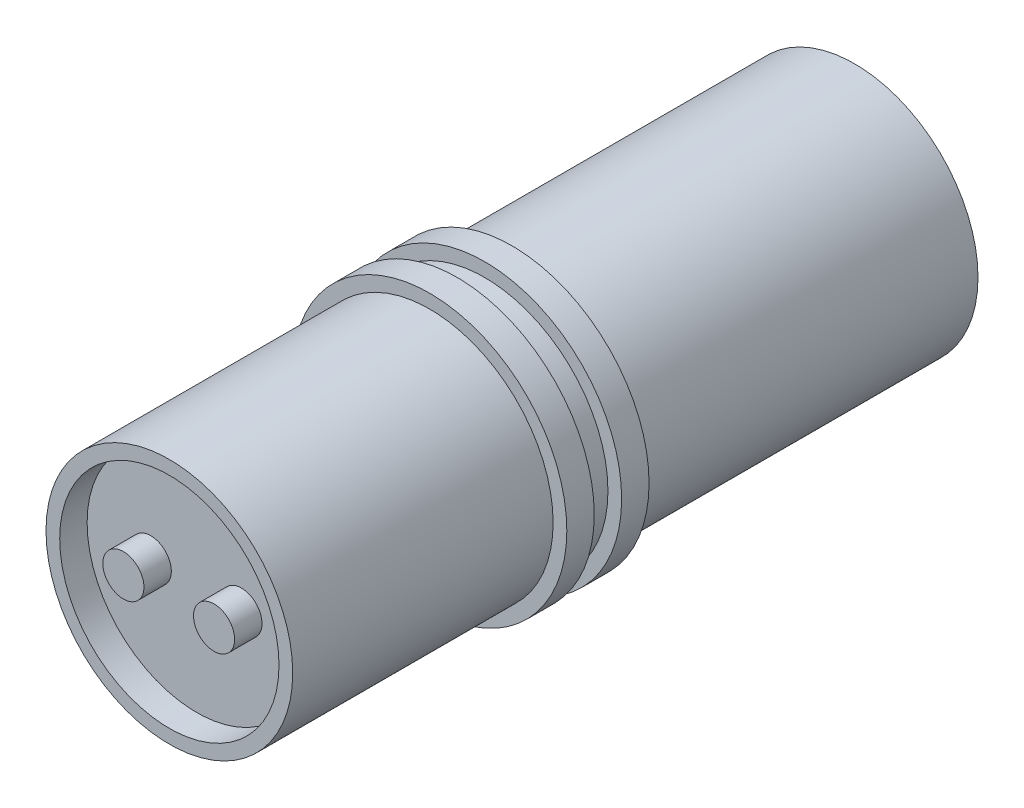
ISO-10303-21;
HEADER;
FILE_DESCRIPTION(('STEP AP214'),'2;1');
FILE_NAME('part.step','',(''),(''),'','','');
FILE_SCHEMA(('AUTOMOTIVE_DESIGN { 1 0 10303 214 1 1 1 1 }'));
ENDSEC;
DATA;
#1=APPLICATION_CONTEXT('core data for automotive mechanical design processes');
#2=APPLICATION_PROTOCOL_DEFINITION('international standard','automotive_design',2000,#1);
#3=PRODUCT_CONTEXT('',#1,'mechanical');
#4=PRODUCT('Part','Part','',(#3));
#5=PRODUCT_RELATED_PRODUCT_CATEGORY('part','',(#4));
#6=PRODUCT_DEFINITION_FORMATION('','',#4);
#7=PRODUCT_DEFINITION_CONTEXT('part definition',#1,'design');
#8=PRODUCT_DEFINITION('design','',#6,#7);
#9=PRODUCT_DEFINITION_SHAPE('','',#8);
#10=(LENGTH_UNIT() NAMED_UNIT(*) SI_UNIT(.MILLI.,.METRE.));
#11=(NAMED_UNIT(*) PLANE_ANGLE_UNIT() SI_UNIT($,.RADIAN.));
#12=(NAMED_UNIT(*) SI_UNIT($,.STERADIAN.) SOLID_ANGLE_UNIT());
#13=UNCERTAINTY_MEASURE_WITH_UNIT(LENGTH_MEASURE(1.E-05),#10,'distance_accuracy_value','');
#14=(GEOMETRIC_REPRESENTATION_CONTEXT(3) GLOBAL_UNCERTAINTY_ASSIGNED_CONTEXT((#13)) GLOBAL_UNIT_ASSIGNED_CONTEXT((#10,
#11,#12)) REPRESENTATION_CONTEXT('',''));
#15=CARTESIAN_POINT('',(0.,0.,0.));
#16=DIRECTION('',(0.,0.,1.));
#17=DIRECTION('',(1.,0.,0.));
#18=AXIS2_PLACEMENT_3D('',#15,#16,#17);
#19=CARTESIAN_POINT('',(0.,0.,0.));
#20=DIRECTION('',(0.,0.,1.));
#21=DIRECTION('',(1.,0.,0.));
#22=AXIS2_PLACEMENT_3D('',#19,#20,#21);
#23=PLANE('',#22);
#24=CARTESIAN_POINT('',(0.,0.,0.));
#25=DIRECTION('',(0.,0.,1.));
#26=DIRECTION('',(1.,0.,0.));
#27=AXIS2_PLACEMENT_3D('',#24,#25,#26);
#28=CIRCLE('',#27,9.);
#29=CARTESIAN_POINT('',(9.,0.,0.));
#30=VERTEX_POINT('',#29);
#31=EDGE_CURVE('E38',#30,#30,#28,.T.);
#32=ORIENTED_EDGE('',*,*,#31,.F.);
#33=EDGE_LOOP('',(#32));
#34=FACE_BOUND('',#33,.T.);
#35=CARTESIAN_POINT('',(-1.71148067478555,4.4792255454098,0.));
#36=DIRECTION('',(0.,0.,-1.));
#37=DIRECTION('',(-1.,0.,0.));
#38=AXIS2_PLACEMENT_3D('',#35,#36,#37);
#39=CIRCLE('',#38,1.15731471558131);
#40=CARTESIAN_POINT('',(-2.63057405736059,5.18253536690231,0.));
#41=VERTEX_POINT('',#40);
#42=CARTESIAN_POINT('',(-0.792387292210506,3.7759157239173,0.));
#43=VERTEX_POINT('',#42);
#44=EDGE_CURVE('E97',#41,#43,#39,.T.);
#45=ORIENTED_EDGE('',*,*,#44,.F.);
#46=DIRECTION('',(0.607708354541435,0.794160283457025,0.));
#47=VECTOR('',#46,1.);
#48=CARTESIAN_POINT('',(-2.63057405736059,5.18253536690231,0.));
#49=LINE('',#48,#47);
#50=CARTESIAN_POINT('',(-6.05817279595736,0.703309821492509,0.));
#51=VERTEX_POINT('',#50);
#52=EDGE_CURVE('E94',#51,#41,#49,.T.);
#53=ORIENTED_EDGE('',*,*,#52,.F.);
#54=CARTESIAN_POINT('',(-5.13907941338232,0.,0.));
#55=DIRECTION('',(0.,0.,-1.));
#56=DIRECTION('',(-1.,0.,0.));
#57=AXIS2_PLACEMENT_3D('',#54,#55,#56);
#58=CIRCLE('',#57,1.15731471558131);
#59=CARTESIAN_POINT('',(-4.21998603080728,-0.703309821492509,0.));
#60=VERTEX_POINT('',#59);
#61=EDGE_CURVE('E56',#60,#51,#58,.T.);
#62=ORIENTED_EDGE('',*,*,#61,.F.);
#63=DIRECTION('',(-0.607708354541435,-0.794160283457025,0.));
#64=VECTOR('',#63,1.);
#65=CARTESIAN_POINT('',(-0.792387292210506,3.7759157239173,0.));
#66=LINE('',#65,#64);
#67=EDGE_CURVE('E51',#43,#60,#66,.T.);
#68=ORIENTED_EDGE('',*,*,#67,.F.);
#69=EDGE_LOOP('',(#45,#53,#62,#68));
#70=FACE_BOUND('',#69,.T.);
#71=ADVANCED_FACE('F34',(#34,#70),#23,.F.);
#72=CARTESIAN_POINT('',(0.,0.,25.));
#73=DIRECTION('',(0.,0.,-1.));
#74=DIRECTION('',(-1.,0.,0.));
#75=AXIS2_PLACEMENT_3D('',#72,#73,#74);
#76=CYLINDRICAL_SURFACE('',#75,9.);
#77=CARTESIAN_POINT('',(0.,0.,25.));
#78=DIRECTION('',(0.,0.,1.));
#79=DIRECTION('',(1.,0.,0.));
#80=AXIS2_PLACEMENT_3D('',#77,#78,#79);
#81=CIRCLE('',#80,9.);
#82=CARTESIAN_POINT('',(9.,0.,25.));
#83=VERTEX_POINT('',#82);
#84=EDGE_CURVE('E136',#83,#83,#81,.T.);
#85=ORIENTED_EDGE('',*,*,#84,.F.);
#86=EDGE_LOOP('',(#85));
#87=FACE_BOUND('',#86,.T.);
#88=ORIENTED_EDGE('',*,*,#31,.T.);
#89=EDGE_LOOP('',(#88));
#90=FACE_BOUND('',#89,.T.);
#91=ADVANCED_FACE('F36',(#87,#90),#76,.T.);
#92=CARTESIAN_POINT('',(0.,0.,27.));
#93=DIRECTION('',(0.,0.,-1.));
#94=DIRECTION('',(-1.,0.,0.));
#95=AXIS2_PLACEMENT_3D('',#92,#93,#94);
#96=CYLINDRICAL_SURFACE('',#95,10.);
#97=CARTESIAN_POINT('',(0.,0.,27.));
#98=DIRECTION('',(0.,0.,1.));
#99=DIRECTION('',(1.,0.,0.));
#100=AXIS2_PLACEMENT_3D('',#97,#98,#99);
#101=CIRCLE('',#100,10.);
#102=CARTESIAN_POINT('',(10.,0.,27.));
#103=VERTEX_POINT('',#102);
#104=EDGE_CURVE('E137',#103,#103,#101,.T.);
#105=ORIENTED_EDGE('',*,*,#104,.F.);
#106=EDGE_LOOP('',(#105));
#107=FACE_BOUND('',#106,.T.);
#108=CARTESIAN_POINT('',(0.,0.,25.));
#109=DIRECTION('',(0.,0.,1.));
#110=DIRECTION('',(1.,0.,0.));
#111=AXIS2_PLACEMENT_3D('',#108,#109,#110);
#112=CIRCLE('',#111,10.);
#113=CARTESIAN_POINT('',(10.,0.,25.));
#114=VERTEX_POINT('',#113);
#115=EDGE_CURVE('E133',#114,#114,#112,.T.);
#116=ORIENTED_EDGE('',*,*,#115,.T.);
#117=EDGE_LOOP('',(#116));
#118=FACE_BOUND('',#117,.T.);
#119=ADVANCED_FACE('F228',(#107,#118),#96,.T.);
#120=CARTESIAN_POINT('',(0.,0.,27.));
#121=DIRECTION('',(0.,0.,1.));
#122=DIRECTION('',(1.,0.,0.));
#123=AXIS2_PLACEMENT_3D('',#120,#121,#122);
#124=PLANE('',#123);
#125=CARTESIAN_POINT('',(0.,0.,27.));
#126=DIRECTION('',(0.,0.,1.));
#127=DIRECTION('',(1.,0.,0.));
#128=AXIS2_PLACEMENT_3D('',#125,#126,#127);
#129=CIRCLE('',#128,9.);
#130=CARTESIAN_POINT('',(9.,0.,27.));
#131=VERTEX_POINT('',#130);
#132=EDGE_CURVE('E43',#131,#131,#129,.T.);
#133=ORIENTED_EDGE('',*,*,#132,.F.);
#134=EDGE_LOOP('',(#133));
#135=FACE_BOUND('',#134,.T.);
#136=ORIENTED_EDGE('',*,*,#104,.T.);
#137=EDGE_LOOP('',(#136));
#138=FACE_BOUND('',#137,.T.);
#139=ADVANCED_FACE('F225',(#135,#138),#124,.T.);
#140=CARTESIAN_POINT('',(0.,0.,25.));
#141=DIRECTION('',(0.,0.,1.));
#142=DIRECTION('',(1.,0.,0.));
#143=AXIS2_PLACEMENT_3D('',#140,#141,#142);
#144=PLANE('',#143);
#145=ORIENTED_EDGE('',*,*,#84,.T.);
#146=EDGE_LOOP('',(#145));
#147=FACE_BOUND('',#146,.T.);
#148=ORIENTED_EDGE('',*,*,#115,.F.);
#149=EDGE_LOOP('',(#148));
#150=FACE_BOUND('',#149,.T.);
#151=ADVANCED_FACE('F223',(#147,#150),#144,.F.);
#152=CARTESIAN_POINT('',(0.,0.,29.));
#153=DIRECTION('',(0.,0.,-1.));
#154=DIRECTION('',(-1.,0.,0.));
#155=AXIS2_PLACEMENT_3D('',#152,#153,#154);
#156=CYLINDRICAL_SURFACE('',#155,9.);
#157=CARTESIAN_POINT('',(0.,0.,29.));
#158=DIRECTION('',(0.,0.,1.));
#159=DIRECTION('',(1.,0.,0.));
#160=AXIS2_PLACEMENT_3D('',#157,#158,#159);
#161=CIRCLE('',#160,9.);
#162=CARTESIAN_POINT('',(9.,0.,29.));
#163=VERTEX_POINT('',#162);
#164=EDGE_CURVE('E128',#163,#163,#161,.T.);
#165=ORIENTED_EDGE('',*,*,#164,.F.);
#166=EDGE_LOOP('',(#165));
#167=FACE_BOUND('',#166,.T.);
#168=ORIENTED_EDGE('',*,*,#132,.T.);
#169=EDGE_LOOP('',(#168));
#170=FACE_BOUND('',#169,.T.);
#171=ADVANCED_FACE('F219',(#167,#170),#156,.T.);
#172=CARTESIAN_POINT('',(0.,0.,31.));
#173=DIRECTION('',(0.,0.,-1.));
#174=DIRECTION('',(-1.,0.,0.));
#175=AXIS2_PLACEMENT_3D('',#172,#173,#174);
#176=CYLINDRICAL_SURFACE('',#175,10.);
#177=CARTESIAN_POINT('',(0.,0.,31.));
#178=DIRECTION('',(0.,0.,1.));
#179=DIRECTION('',(1.,0.,0.));
#180=AXIS2_PLACEMENT_3D('',#177,#178,#179);
#181=CIRCLE('',#180,10.);
#182=CARTESIAN_POINT('',(10.,0.,31.));
#183=VERTEX_POINT('',#182);
#184=EDGE_CURVE('E125',#183,#183,#181,.T.);
#185=ORIENTED_EDGE('',*,*,#184,.F.);
#186=EDGE_LOOP('',(#185));
#187=FACE_BOUND('',#186,.T.);
#188=CARTESIAN_POINT('',(0.,0.,29.));
#189=DIRECTION('',(0.,0.,1.));
#190=DIRECTION('',(1.,0.,0.));
#191=AXIS2_PLACEMENT_3D('',#188,#189,#190);
#192=CIRCLE('',#191,10.);
#193=CARTESIAN_POINT('',(10.,0.,29.));
#194=VERTEX_POINT('',#193);
#195=EDGE_CURVE('E123',#194,#194,#192,.T.);
#196=ORIENTED_EDGE('',*,*,#195,.T.);
#197=EDGE_LOOP('',(#196));
#198=FACE_BOUND('',#197,.T.);
#199=ADVANCED_FACE('F212',(#187,#198),#176,.T.);
#200=CARTESIAN_POINT('',(0.,0.,31.));
#201=DIRECTION('',(0.,0.,1.));
#202=DIRECTION('',(1.,0.,0.));
#203=AXIS2_PLACEMENT_3D('',#200,#201,#202);
#204=PLANE('',#203);
#205=CARTESIAN_POINT('',(0.,0.,31.));
#206=DIRECTION('',(0.,0.,1.));
#207=DIRECTION('',(1.,0.,0.));
#208=AXIS2_PLACEMENT_3D('',#205,#206,#207);
#209=CIRCLE('',#208,9.);
#210=CARTESIAN_POINT('',(9.,0.,31.));
#211=VERTEX_POINT('',#210);
#212=EDGE_CURVE('E11',#211,#211,#209,.T.);
#213=ORIENTED_EDGE('',*,*,#212,.F.);
#214=EDGE_LOOP('',(#213));
#215=FACE_BOUND('',#214,.T.);
#216=ORIENTED_EDGE('',*,*,#184,.T.);
#217=EDGE_LOOP('',(#216));
#218=FACE_BOUND('',#217,.T.);
#219=ADVANCED_FACE('F209',(#215,#218),#204,.T.);
#220=CARTESIAN_POINT('',(0.,0.,29.));
#221=DIRECTION('',(0.,0.,1.));
#222=DIRECTION('',(1.,0.,0.));
#223=AXIS2_PLACEMENT_3D('',#220,#221,#222);
#224=PLANE('',#223);
#225=ORIENTED_EDGE('',*,*,#164,.T.);
#226=EDGE_LOOP('',(#225));
#227=FACE_BOUND('',#226,.T.);
#228=ORIENTED_EDGE('',*,*,#195,.F.);
#229=EDGE_LOOP('',(#228));
#230=FACE_BOUND('',#229,.T.);
#231=ADVANCED_FACE('F207',(#227,#230),#224,.F.);
#232=CARTESIAN_POINT('',(0.,0.,50.));
#233=DIRECTION('',(0.,0.,-1.));
#234=DIRECTION('',(-1.,0.,0.));
#235=AXIS2_PLACEMENT_3D('',#232,#233,#234);
#236=CYLINDRICAL_SURFACE('',#235,9.);
#237=CARTESIAN_POINT('',(0.,0.,50.));
#238=DIRECTION('',(0.,0.,1.));
#239=DIRECTION('',(1.,0.,0.));
#240=AXIS2_PLACEMENT_3D('',#237,#238,#239);
#241=CIRCLE('',#240,9.);
#242=CARTESIAN_POINT('',(9.,0.,50.));
#243=VERTEX_POINT('',#242);
#244=EDGE_CURVE('E119',#243,#243,#241,.T.);
#245=ORIENTED_EDGE('',*,*,#244,.F.);
#246=EDGE_LOOP('',(#245));
#247=FACE_BOUND('',#246,.T.);
#248=ORIENTED_EDGE('',*,*,#212,.T.);
#249=EDGE_LOOP('',(#248));
#250=FACE_BOUND('',#249,.T.);
#251=ADVANCED_FACE('F203',(#247,#250),#236,.T.);
#252=CARTESIAN_POINT('',(0.,0.,50.));
#253=DIRECTION('',(0.,0.,1.));
#254=DIRECTION('',(1.,0.,0.));
#255=AXIS2_PLACEMENT_3D('',#252,#253,#254);
#256=PLANE('',#255);
#257=CARTESIAN_POINT('',(0.,0.,50.));
#258=DIRECTION('',(0.,0.,1.));
#259=DIRECTION('',(1.,0.,0.));
#260=AXIS2_PLACEMENT_3D('',#257,#258,#259);
#261=CIRCLE('',#260,8.);
#262=CARTESIAN_POINT('',(8.,0.,50.));
#263=VERTEX_POINT('',#262);
#264=EDGE_CURVE('E113',#263,#263,#261,.T.);
#265=ORIENTED_EDGE('',*,*,#264,.F.);
#266=EDGE_LOOP('',(#265));
#267=FACE_BOUND('',#266,.T.);
#268=ORIENTED_EDGE('',*,*,#244,.T.);
#269=EDGE_LOOP('',(#268));
#270=FACE_BOUND('',#269,.T.);
#271=ADVANCED_FACE('F199',(#267,#270),#256,.T.);
#272=CARTESIAN_POINT('',(0.,0.,48.));
#273=DIRECTION('',(0.,0.,1.));
#274=DIRECTION('',(1.,0.,0.));
#275=AXIS2_PLACEMENT_3D('',#272,#273,#274);
#276=CYLINDRICAL_SURFACE('',#275,8.);
#277=CARTESIAN_POINT('',(0.,0.,48.));
#278=DIRECTION('',(0.,0.,1.));
#279=DIRECTION('',(1.,0.,0.));
#280=AXIS2_PLACEMENT_3D('',#277,#278,#279);
#281=CIRCLE('',#280,8.);
#282=CARTESIAN_POINT('',(8.,0.,48.));
#283=VERTEX_POINT('',#282);
#284=EDGE_CURVE('E116',#283,#283,#281,.T.);
#285=ORIENTED_EDGE('',*,*,#284,.F.);
#286=EDGE_LOOP('',(#285));
#287=FACE_BOUND('',#286,.T.);
#288=ORIENTED_EDGE('',*,*,#264,.T.);
#289=EDGE_LOOP('',(#288));
#290=FACE_BOUND('',#289,.T.);
#291=ADVANCED_FACE('F195',(#287,#290),#276,.F.);
#292=CARTESIAN_POINT('',(0.,0.,48.));
#293=DIRECTION('',(0.,0.,1.));
#294=DIRECTION('',(1.,0.,0.));
#295=AXIS2_PLACEMENT_3D('',#292,#293,#294);
#296=PLANE('',#295);
#297=CARTESIAN_POINT('',(3.26255432913314,0.,48.));
#298=DIRECTION('',(0.,0.,1.));
#299=DIRECTION('',(1.,0.,0.));
#300=AXIS2_PLACEMENT_3D('',#297,#298,#299);
#301=CIRCLE('',#300,1.5);
#302=CARTESIAN_POINT('',(4.76255432913314,0.,48.));
#303=VERTEX_POINT('',#302);
#304=EDGE_CURVE('E98',#303,#303,#301,.T.);
#305=ORIENTED_EDGE('',*,*,#304,.F.);
#306=EDGE_LOOP('',(#305));
#307=FACE_BOUND('',#306,.T.);
#308=CARTESIAN_POINT('',(-3.3545711743237,0.,48.));
#309=DIRECTION('',(0.,0.,1.));
#310=DIRECTION('',(1.,0.,0.));
#311=AXIS2_PLACEMENT_3D('',#308,#309,#310);
#312=CIRCLE('',#311,1.5);
#313=CARTESIAN_POINT('',(-1.85457117432369,0.,48.));
#314=VERTEX_POINT('',#313);
#315=EDGE_CURVE('E108',#314,#314,#312,.T.);
#316=ORIENTED_EDGE('',*,*,#315,.F.);
#317=EDGE_LOOP('',(#316));
#318=FACE_BOUND('',#317,.T.);
#319=ORIENTED_EDGE('',*,*,#284,.T.);
#320=EDGE_LOOP('',(#319));
#321=FACE_BOUND('',#320,.T.);
#322=ADVANCED_FACE('F191',(#307,#318,#321),#296,.T.);
#323=CARTESIAN_POINT('',(-3.3545711743237,0.,50.));
#324=DIRECTION('',(0.,0.,-1.));
#325=DIRECTION('',(-1.,0.,0.));
#326=AXIS2_PLACEMENT_3D('',#323,#324,#325);
#327=CYLINDRICAL_SURFACE('',#326,1.5);
#328=CARTESIAN_POINT('',(-3.3545711743237,0.,50.));
#329=DIRECTION('',(0.,0.,1.));
#330=DIRECTION('',(1.,0.,0.));
#331=AXIS2_PLACEMENT_3D('',#328,#329,#330);
#332=CIRCLE('',#331,1.5);
#333=CARTESIAN_POINT('',(-1.85457117432369,0.,50.));
#334=VERTEX_POINT('',#333);
#335=EDGE_CURVE('E110',#334,#334,#332,.T.);
#336=ORIENTED_EDGE('',*,*,#335,.F.);
#337=EDGE_LOOP('',(#336));
#338=FACE_BOUND('',#337,.T.);
#339=ORIENTED_EDGE('',*,*,#315,.T.);
#340=EDGE_LOOP('',(#339));
#341=FACE_BOUND('',#340,.T.);
#342=ADVANCED_FACE('F187',(#338,#341),#327,.T.);
#343=CARTESIAN_POINT('',(-3.3545711743237,0.,50.));
#344=DIRECTION('',(0.,0.,1.));
#345=DIRECTION('',(1.,0.,0.));
#346=AXIS2_PLACEMENT_3D('',#343,#344,#345);
#347=PLANE('',#346);
#348=ORIENTED_EDGE('',*,*,#335,.T.);
#349=EDGE_LOOP('',(#348));
#350=FACE_BOUND('',#349,.T.);
#351=ADVANCED_FACE('F183',(#350),#347,.T.);
#352=CARTESIAN_POINT('',(3.26255432913314,0.,50.));
#353=DIRECTION('',(0.,0.,-1.));
#354=DIRECTION('',(-1.,0.,0.));
#355=AXIS2_PLACEMENT_3D('',#352,#353,#354);
#356=CYLINDRICAL_SURFACE('',#355,1.5);
#357=CARTESIAN_POINT('',(3.26255432913314,0.,50.));
#358=DIRECTION('',(0.,0.,1.));
#359=DIRECTION('',(1.,0.,0.));
#360=AXIS2_PLACEMENT_3D('',#357,#358,#359);
#361=CIRCLE('',#360,1.5);
#362=CARTESIAN_POINT('',(4.76255432913314,0.,50.));
#363=VERTEX_POINT('',#362);
#364=EDGE_CURVE('E101',#363,#363,#361,.T.);
#365=ORIENTED_EDGE('',*,*,#364,.F.);
#366=EDGE_LOOP('',(#365));
#367=FACE_BOUND('',#366,.T.);
#368=ORIENTED_EDGE('',*,*,#304,.T.);
#369=EDGE_LOOP('',(#368));
#370=FACE_BOUND('',#369,.T.);
#371=ADVANCED_FACE('F179',(#367,#370),#356,.T.);
#372=CARTESIAN_POINT('',(3.26255432913314,0.,50.));
#373=DIRECTION('',(0.,0.,1.));
#374=DIRECTION('',(1.,0.,0.));
#375=AXIS2_PLACEMENT_3D('',#372,#373,#374);
#376=PLANE('',#375);
#377=ORIENTED_EDGE('',*,*,#364,.T.);
#378=EDGE_LOOP('',(#377));
#379=FACE_BOUND('',#378,.T.);
#380=ADVANCED_FACE('F176',(#379),#376,.T.);
#381=CARTESIAN_POINT('',(-1.71148067478555,4.4792255454098,-2.));
#382=DIRECTION('',(0.,0.,1.));
#383=DIRECTION('',(1.,0.,0.));
#384=AXIS2_PLACEMENT_3D('',#381,#382,#383);
#385=CYLINDRICAL_SURFACE('',#384,1.15731471558131);
#386=ORIENTED_EDGE('',*,*,#44,.T.);
#387=DIRECTION('',(0.,0.,1.));
#388=VECTOR('',#387,1.);
#389=CARTESIAN_POINT('',(-0.792387292210506,3.7759157239173,-2.));
#390=LINE('',#389,#388);
#391=CARTESIAN_POINT('',(-0.792387292210506,3.7759157239173,-2.));
#392=VERTEX_POINT('',#391);
#393=EDGE_CURVE('E78',#392,#43,#390,.T.);
#394=ORIENTED_EDGE('',*,*,#393,.F.);
#395=CARTESIAN_POINT('',(-1.71148067478555,4.4792255454098,-2.));
#396=DIRECTION('',(0.,0.,-1.));
#397=DIRECTION('',(-1.,0.,0.));
#398=AXIS2_PLACEMENT_3D('',#395,#396,#397);
#399=CIRCLE('',#398,1.15731471558131);
#400=CARTESIAN_POINT('',(-2.63057405736059,5.18253536690231,-2.));
#401=VERTEX_POINT('',#400);
#402=EDGE_CURVE('E85',#401,#392,#399,.T.);
#403=ORIENTED_EDGE('',*,*,#402,.F.);
#404=DIRECTION('',(0.,0.,1.));
#405=VECTOR('',#404,1.);
#406=CARTESIAN_POINT('',(-2.63057405736059,5.18253536690231,-2.));
#407=LINE('',#406,#405);
#408=EDGE_CURVE('E154',#401,#41,#407,.T.);
#409=ORIENTED_EDGE('',*,*,#408,.T.);
#410=EDGE_LOOP('',(#386,#394,#403,#409));
#411=FACE_BOUND('',#410,.T.);
#412=ADVANCED_FACE('F96',(#411),#385,.T.);
#413=CARTESIAN_POINT('',(-0.792387292210506,3.7759157239173,-2.));
#414=DIRECTION('',(-0.794160283457025,0.607708354541435,0.));
#415=DIRECTION('',(-0.607708354541435,-0.794160283457025,0.));
#416=AXIS2_PLACEMENT_3D('',#413,#414,#415);
#417=PLANE('',#416);
#418=ORIENTED_EDGE('',*,*,#67,.T.);
#419=DIRECTION('',(0.,0.,1.));
#420=VECTOR('',#419,1.);
#421=CARTESIAN_POINT('',(-4.21998603080728,-0.703309821492508,-2.));
#422=LINE('',#421,#420);
#423=CARTESIAN_POINT('',(-4.21998603080728,-0.703309821492508,-2.));
#424=VERTEX_POINT('',#423);
#425=EDGE_CURVE('E81',#424,#60,#422,.T.);
#426=ORIENTED_EDGE('',*,*,#425,.F.);
#427=DIRECTION('',(-0.607708354541435,-0.794160283457025,0.));
#428=VECTOR('',#427,1.);
#429=CARTESIAN_POINT('',(-0.792387292210506,3.7759157239173,-2.));
#430=LINE('',#429,#428);
#431=EDGE_CURVE('E74',#392,#424,#430,.T.);
#432=ORIENTED_EDGE('',*,*,#431,.F.);
#433=ORIENTED_EDGE('',*,*,#393,.T.);
#434=EDGE_LOOP('',(#418,#426,#432,#433));
#435=FACE_BOUND('',#434,.T.);
#436=ADVANCED_FACE('F76',(#435),#417,.F.);
#437=CARTESIAN_POINT('',(-5.13907941338232,0.,-2.));
#438=DIRECTION('',(0.,0.,1.));
#439=DIRECTION('',(1.,0.,0.));
#440=AXIS2_PLACEMENT_3D('',#437,#438,#439);
#441=CYLINDRICAL_SURFACE('',#440,1.15731471558131);
#442=ORIENTED_EDGE('',*,*,#61,.T.);
#443=DIRECTION('',(0.,0.,1.));
#444=VECTOR('',#443,1.);
#445=CARTESIAN_POINT('',(-6.05817279595736,0.703309821492509,-2.));
#446=LINE('',#445,#444);
#447=CARTESIAN_POINT('',(-6.05817279595736,0.703309821492509,-2.));
#448=VERTEX_POINT('',#447);
#449=EDGE_CURVE('E103',#448,#51,#446,.T.);
#450=ORIENTED_EDGE('',*,*,#449,.F.);
#451=CARTESIAN_POINT('',(-5.13907941338232,0.,-2.));
#452=DIRECTION('',(0.,0.,-1.));
#453=DIRECTION('',(-1.,0.,0.));
#454=AXIS2_PLACEMENT_3D('',#451,#452,#453);
#455=CIRCLE('',#454,1.15731471558131);
#456=EDGE_CURVE('E84',#424,#448,#455,.T.);
#457=ORIENTED_EDGE('',*,*,#456,.F.);
#458=ORIENTED_EDGE('',*,*,#425,.T.);
#459=EDGE_LOOP('',(#442,#450,#457,#458));
#460=FACE_BOUND('',#459,.T.);
#461=ADVANCED_FACE('F163',(#460),#441,.T.);
#462=CARTESIAN_POINT('',(-2.63057405736059,5.18253536690231,-2.));
#463=DIRECTION('',(0.794160283457025,-0.607708354541435,0.));
#464=DIRECTION('',(0.607708354541435,0.794160283457025,0.));
#465=AXIS2_PLACEMENT_3D('',#462,#463,#464);
#466=PLANE('',#465);
#467=ORIENTED_EDGE('',*,*,#52,.T.);
#468=ORIENTED_EDGE('',*,*,#408,.F.);
#469=DIRECTION('',(0.607708354541435,0.794160283457025,0.));
#470=VECTOR('',#469,1.);
#471=CARTESIAN_POINT('',(-2.63057405736059,5.18253536690231,-2.));
#472=LINE('',#471,#470);
#473=EDGE_CURVE('E90',#448,#401,#472,.T.);
#474=ORIENTED_EDGE('',*,*,#473,.F.);
#475=ORIENTED_EDGE('',*,*,#449,.T.);
#476=EDGE_LOOP('',(#467,#468,#474,#475));
#477=FACE_BOUND('',#476,.T.);
#478=ADVANCED_FACE('F153',(#477),#466,.F.);
#479=CARTESIAN_POINT('',(-1.71148067478555,4.4792255454098,-2.));
#480=DIRECTION('',(0.,0.,-1.));
#481=DIRECTION('',(-1.,0.,0.));
#482=AXIS2_PLACEMENT_3D('',#479,#480,#481);
#483=PLANE('',#482);
#484=ORIENTED_EDGE('',*,*,#402,.T.);
#485=ORIENTED_EDGE('',*,*,#431,.T.);
#486=ORIENTED_EDGE('',*,*,#456,.T.);
#487=ORIENTED_EDGE('',*,*,#473,.T.);
#488=EDGE_LOOP('',(#484,#485,#486,#487));
#489=FACE_BOUND('',#488,.T.);
#490=ADVANCED_FACE('F88',(#489),#483,.T.);
#491=CLOSED_SHELL('',(#71,#91,#119,#139,#151,#171,#199,#219,#231,#251,#271,#291,#322,#342,#351,
#371,#380,#412,#436,#461,#478,#490));
#492=MANIFOLD_SOLID_BREP('B2',#491);
#493=ADVANCED_BREP_SHAPE_REPRESENTATION('',(#18,#492),#14);
#494=SHAPE_DEFINITION_REPRESENTATION(#9,#493);
ENDSEC;
END-ISO-10303-21;
